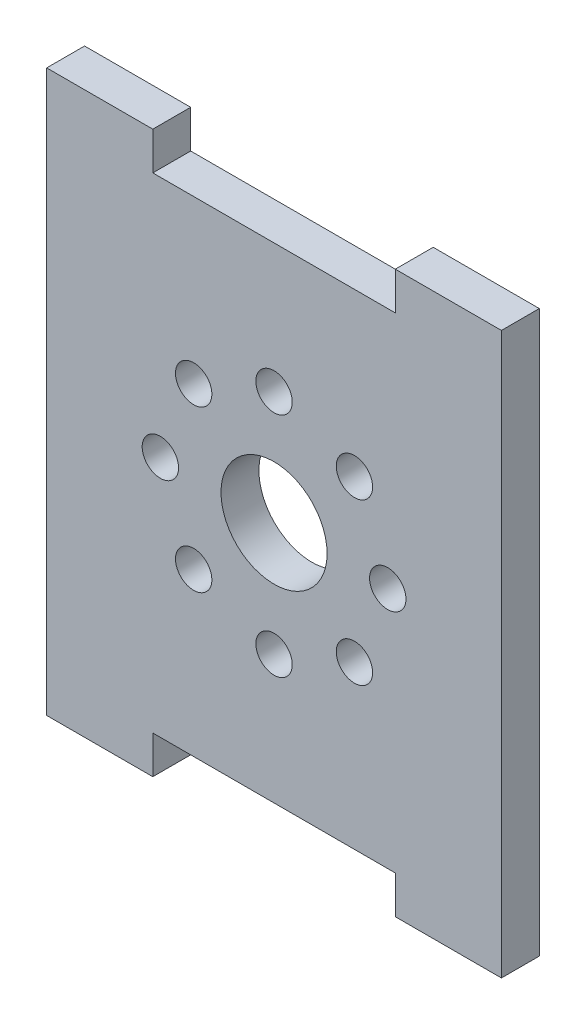
ISO-10303-21;
HEADER;
FILE_DESCRIPTION(('STEP AP214'),'2;1');
FILE_NAME('part.step','',(''),(''),'','','');
FILE_SCHEMA(('AUTOMOTIVE_DESIGN { 1 0 10303 214 1 1 1 1 }'));
ENDSEC;
DATA;
#1=APPLICATION_CONTEXT('core data for automotive mechanical design processes');
#2=APPLICATION_PROTOCOL_DEFINITION('international standard','automotive_design',2000,#1);
#3=PRODUCT_CONTEXT('',#1,'mechanical');
#4=PRODUCT('Part','Part','',(#3));
#5=PRODUCT_RELATED_PRODUCT_CATEGORY('part','',(#4));
#6=PRODUCT_DEFINITION_FORMATION('','',#4);
#7=PRODUCT_DEFINITION_CONTEXT('part definition',#1,'design');
#8=PRODUCT_DEFINITION('design','',#6,#7);
#9=PRODUCT_DEFINITION_SHAPE('','',#8);
#10=(LENGTH_UNIT() NAMED_UNIT(*) SI_UNIT(.MILLI.,.METRE.));
#11=(NAMED_UNIT(*) PLANE_ANGLE_UNIT() SI_UNIT($,.RADIAN.));
#12=(NAMED_UNIT(*) SI_UNIT($,.STERADIAN.) SOLID_ANGLE_UNIT());
#13=UNCERTAINTY_MEASURE_WITH_UNIT(LENGTH_MEASURE(1.E-05),#10,'distance_accuracy_value','');
#14=(GEOMETRIC_REPRESENTATION_CONTEXT(3) GLOBAL_UNCERTAINTY_ASSIGNED_CONTEXT((#13)) GLOBAL_UNIT_ASSIGNED_CONTEXT((#10,
#11,#12)) REPRESENTATION_CONTEXT('',''));
#15=CARTESIAN_POINT('',(0.,0.,0.));
#16=DIRECTION('',(0.,0.,1.));
#17=DIRECTION('',(1.,0.,0.));
#18=AXIS2_PLACEMENT_3D('',#15,#16,#17);
#19=CARTESIAN_POINT('',(0.,-16.,2.5));
#20=DIRECTION('',(0.,1.,0.));
#21=DIRECTION('',(0.,0.,1.));
#22=AXIS2_PLACEMENT_3D('',#19,#20,#21);
#23=PLANE('',#22);
#24=DIRECTION('',(1.,0.,0.));
#25=VECTOR('',#24,1.);
#26=CARTESIAN_POINT('',(0.,-16.,0.));
#27=LINE('',#26,#25);
#28=CARTESIAN_POINT('',(-8.,-16.,0.));
#29=VERTEX_POINT('',#28);
#30=CARTESIAN_POINT('',(8.,-16.,0.));
#31=VERTEX_POINT('',#30);
#32=EDGE_CURVE('E247',#29,#31,#27,.T.);
#33=ORIENTED_EDGE('',*,*,#32,.T.);
#34=DIRECTION('',(0.,0.,-1.));
#35=VECTOR('',#34,1.);
#36=CARTESIAN_POINT('',(8.,-16.,2.5));
#37=LINE('',#36,#35);
#38=CARTESIAN_POINT('',(8.,-16.,2.5));
#39=VERTEX_POINT('',#38);
#40=EDGE_CURVE('E11',#39,#31,#37,.T.);
#41=ORIENTED_EDGE('',*,*,#40,.F.);
#42=DIRECTION('',(1.,0.,0.));
#43=VECTOR('',#42,1.);
#44=CARTESIAN_POINT('',(0.,-16.,2.5));
#45=LINE('',#44,#43);
#46=CARTESIAN_POINT('',(-8.,-16.,2.5));
#47=VERTEX_POINT('',#46);
#48=EDGE_CURVE('E162',#47,#39,#45,.T.);
#49=ORIENTED_EDGE('',*,*,#48,.F.);
#50=DIRECTION('',(0.,0.,-1.));
#51=VECTOR('',#50,1.);
#52=CARTESIAN_POINT('',(-8.,-16.,2.5));
#53=LINE('',#52,#51);
#54=EDGE_CURVE('E52',#47,#29,#53,.T.);
#55=ORIENTED_EDGE('',*,*,#54,.T.);
#56=EDGE_LOOP('',(#33,#41,#49,#55));
#57=FACE_BOUND('',#56,.T.);
#58=ADVANCED_FACE('F35',(#57),#23,.F.);
#59=CARTESIAN_POINT('',(8.,0.,2.5));
#60=DIRECTION('',(1.,0.,0.));
#61=DIRECTION('',(0.,0.,-1.));
#62=AXIS2_PLACEMENT_3D('',#59,#60,#61);
#63=PLANE('',#62);
#64=DIRECTION('',(0.,-1.,0.));
#65=VECTOR('',#64,1.);
#66=CARTESIAN_POINT('',(8.,0.,0.));
#67=LINE('',#66,#65);
#68=CARTESIAN_POINT('',(8.,-18.5,0.));
#69=VERTEX_POINT('',#68);
#70=EDGE_CURVE('E249',#31,#69,#67,.T.);
#71=ORIENTED_EDGE('',*,*,#70,.T.);
#72=DIRECTION('',(0.,0.,-1.));
#73=VECTOR('',#72,1.);
#74=CARTESIAN_POINT('',(8.,-18.5,2.5));
#75=LINE('',#74,#73);
#76=CARTESIAN_POINT('',(8.,-18.5,2.5));
#77=VERTEX_POINT('',#76);
#78=EDGE_CURVE('E44',#77,#69,#75,.T.);
#79=ORIENTED_EDGE('',*,*,#78,.F.);
#80=DIRECTION('',(0.,-1.,0.));
#81=VECTOR('',#80,1.);
#82=CARTESIAN_POINT('',(8.,0.,2.5));
#83=LINE('',#82,#81);
#84=EDGE_CURVE('E102',#39,#77,#83,.T.);
#85=ORIENTED_EDGE('',*,*,#84,.F.);
#86=ORIENTED_EDGE('',*,*,#40,.T.);
#87=EDGE_LOOP('',(#71,#79,#85,#86));
#88=FACE_BOUND('',#87,.T.);
#89=ADVANCED_FACE('F293',(#88),#63,.F.);
#90=CARTESIAN_POINT('',(0.,-18.5,2.5));
#91=DIRECTION('',(0.,-1.,0.));
#92=DIRECTION('',(0.,0.,-1.));
#93=AXIS2_PLACEMENT_3D('',#90,#91,#92);
#94=PLANE('',#93);
#95=DIRECTION('',(-1.,0.,0.));
#96=VECTOR('',#95,1.);
#97=CARTESIAN_POINT('',(0.,-18.5,0.));
#98=LINE('',#97,#96);
#99=CARTESIAN_POINT('',(15.,-18.5,0.));
#100=VERTEX_POINT('',#99);
#101=EDGE_CURVE('E254',#100,#69,#98,.T.);
#102=ORIENTED_EDGE('',*,*,#101,.F.);
#103=DIRECTION('',(0.,0.,-1.));
#104=VECTOR('',#103,1.);
#105=CARTESIAN_POINT('',(15.,-18.5,2.5));
#106=LINE('',#105,#104);
#107=CARTESIAN_POINT('',(15.,-18.5,2.5));
#108=VERTEX_POINT('',#107);
#109=EDGE_CURVE('E290',#108,#100,#106,.T.);
#110=ORIENTED_EDGE('',*,*,#109,.F.);
#111=DIRECTION('',(-1.,0.,0.));
#112=VECTOR('',#111,1.);
#113=CARTESIAN_POINT('',(0.,-18.5,2.5));
#114=LINE('',#113,#112);
#115=EDGE_CURVE('E153',#108,#77,#114,.T.);
#116=ORIENTED_EDGE('',*,*,#115,.T.);
#117=ORIENTED_EDGE('',*,*,#78,.T.);
#118=EDGE_LOOP('',(#102,#110,#116,#117));
#119=FACE_BOUND('',#118,.T.);
#120=ADVANCED_FACE('F292',(#119),#94,.T.);
#121=CARTESIAN_POINT('',(15.,0.,2.5));
#122=DIRECTION('',(-1.,0.,0.));
#123=DIRECTION('',(0.,0.,1.));
#124=AXIS2_PLACEMENT_3D('',#121,#122,#123);
#125=PLANE('',#124);
#126=DIRECTION('',(0.,1.,0.));
#127=VECTOR('',#126,1.);
#128=CARTESIAN_POINT('',(15.,0.,0.));
#129=LINE('',#128,#127);
#130=CARTESIAN_POINT('',(15.,18.5,0.));
#131=VERTEX_POINT('',#130);
#132=EDGE_CURVE('E257',#100,#131,#129,.T.);
#133=ORIENTED_EDGE('',*,*,#132,.T.);
#134=DIRECTION('',(0.,0.,-1.));
#135=VECTOR('',#134,1.);
#136=CARTESIAN_POINT('',(15.,18.5,2.5));
#137=LINE('',#136,#135);
#138=CARTESIAN_POINT('',(15.,18.5,2.5));
#139=VERTEX_POINT('',#138);
#140=EDGE_CURVE('E287',#139,#131,#137,.T.);
#141=ORIENTED_EDGE('',*,*,#140,.F.);
#142=DIRECTION('',(0.,1.,0.));
#143=VECTOR('',#142,1.);
#144=CARTESIAN_POINT('',(15.,0.,2.5));
#145=LINE('',#144,#143);
#146=EDGE_CURVE('E158',#108,#139,#145,.T.);
#147=ORIENTED_EDGE('',*,*,#146,.F.);
#148=ORIENTED_EDGE('',*,*,#109,.T.);
#149=EDGE_LOOP('',(#133,#141,#147,#148));
#150=FACE_BOUND('',#149,.T.);
#151=ADVANCED_FACE('F300',(#150),#125,.F.);
#152=CARTESIAN_POINT('',(0.,18.5,2.5));
#153=DIRECTION('',(0.,-1.,0.));
#154=DIRECTION('',(0.,0.,-1.));
#155=AXIS2_PLACEMENT_3D('',#152,#153,#154);
#156=PLANE('',#155);
#157=DIRECTION('',(-1.,0.,0.));
#158=VECTOR('',#157,1.);
#159=CARTESIAN_POINT('',(0.,18.5,0.));
#160=LINE('',#159,#158);
#161=CARTESIAN_POINT('',(8.,18.5,0.));
#162=VERTEX_POINT('',#161);
#163=EDGE_CURVE('E260',#131,#162,#160,.T.);
#164=ORIENTED_EDGE('',*,*,#163,.T.);
#165=DIRECTION('',(0.,0.,-1.));
#166=VECTOR('',#165,1.);
#167=CARTESIAN_POINT('',(8.,18.5,2.5));
#168=LINE('',#167,#166);
#169=CARTESIAN_POINT('',(8.,18.5,2.5));
#170=VERTEX_POINT('',#169);
#171=EDGE_CURVE('E285',#170,#162,#168,.T.);
#172=ORIENTED_EDGE('',*,*,#171,.F.);
#173=DIRECTION('',(-1.,0.,0.));
#174=VECTOR('',#173,1.);
#175=CARTESIAN_POINT('',(0.,18.5,2.5));
#176=LINE('',#175,#174);
#177=EDGE_CURVE('E161',#139,#170,#176,.T.);
#178=ORIENTED_EDGE('',*,*,#177,.F.);
#179=ORIENTED_EDGE('',*,*,#140,.T.);
#180=EDGE_LOOP('',(#164,#172,#178,#179));
#181=FACE_BOUND('',#180,.T.);
#182=ADVANCED_FACE('F304',(#181),#156,.F.);
#183=CARTESIAN_POINT('',(8.,0.,2.5));
#184=DIRECTION('',(-1.,0.,0.));
#185=DIRECTION('',(0.,0.,1.));
#186=AXIS2_PLACEMENT_3D('',#183,#184,#185);
#187=PLANE('',#186);
#188=DIRECTION('',(0.,1.,0.));
#189=VECTOR('',#188,1.);
#190=CARTESIAN_POINT('',(8.,0.,0.));
#191=LINE('',#190,#189);
#192=CARTESIAN_POINT('',(8.,16.,0.));
#193=VERTEX_POINT('',#192);
#194=EDGE_CURVE('E263',#193,#162,#191,.T.);
#195=ORIENTED_EDGE('',*,*,#194,.F.);
#196=DIRECTION('',(0.,0.,-1.));
#197=VECTOR('',#196,1.);
#198=CARTESIAN_POINT('',(8.,16.,2.5));
#199=LINE('',#198,#197);
#200=CARTESIAN_POINT('',(8.,16.,2.5));
#201=VERTEX_POINT('',#200);
#202=EDGE_CURVE('E283',#201,#193,#199,.T.);
#203=ORIENTED_EDGE('',*,*,#202,.F.);
#204=DIRECTION('',(0.,1.,0.));
#205=VECTOR('',#204,1.);
#206=CARTESIAN_POINT('',(8.,0.,2.5));
#207=LINE('',#206,#205);
#208=EDGE_CURVE('E308',#201,#170,#207,.T.);
#209=ORIENTED_EDGE('',*,*,#208,.T.);
#210=ORIENTED_EDGE('',*,*,#171,.T.);
#211=EDGE_LOOP('',(#195,#203,#209,#210));
#212=FACE_BOUND('',#211,.T.);
#213=ADVANCED_FACE('F344',(#212),#187,.T.);
#214=CARTESIAN_POINT('',(0.,16.,2.5));
#215=DIRECTION('',(0.,-1.,0.));
#216=DIRECTION('',(0.,0.,-1.));
#217=AXIS2_PLACEMENT_3D('',#214,#215,#216);
#218=PLANE('',#217);
#219=DIRECTION('',(-1.,0.,0.));
#220=VECTOR('',#219,1.);
#221=CARTESIAN_POINT('',(0.,16.,0.));
#222=LINE('',#221,#220);
#223=CARTESIAN_POINT('',(-8.,16.,0.));
#224=VERTEX_POINT('',#223);
#225=EDGE_CURVE('E267',#193,#224,#222,.T.);
#226=ORIENTED_EDGE('',*,*,#225,.T.);
#227=DIRECTION('',(0.,0.,-1.));
#228=VECTOR('',#227,1.);
#229=CARTESIAN_POINT('',(-8.,16.,2.5));
#230=LINE('',#229,#228);
#231=CARTESIAN_POINT('',(-8.,16.,2.5));
#232=VERTEX_POINT('',#231);
#233=EDGE_CURVE('E280',#232,#224,#230,.T.);
#234=ORIENTED_EDGE('',*,*,#233,.F.);
#235=DIRECTION('',(-1.,0.,0.));
#236=VECTOR('',#235,1.);
#237=CARTESIAN_POINT('',(0.,16.,2.5));
#238=LINE('',#237,#236);
#239=EDGE_CURVE('E310',#201,#232,#238,.T.);
#240=ORIENTED_EDGE('',*,*,#239,.F.);
#241=ORIENTED_EDGE('',*,*,#202,.T.);
#242=EDGE_LOOP('',(#226,#234,#240,#241));
#243=FACE_BOUND('',#242,.T.);
#244=ADVANCED_FACE('F320',(#243),#218,.F.);
#245=CARTESIAN_POINT('',(-8.,0.,2.5));
#246=DIRECTION('',(-1.,0.,0.));
#247=DIRECTION('',(0.,0.,1.));
#248=AXIS2_PLACEMENT_3D('',#245,#246,#247);
#249=PLANE('',#248);
#250=DIRECTION('',(0.,1.,0.));
#251=VECTOR('',#250,1.);
#252=CARTESIAN_POINT('',(-8.,0.,0.));
#253=LINE('',#252,#251);
#254=CARTESIAN_POINT('',(-8.,18.5,0.));
#255=VERTEX_POINT('',#254);
#256=EDGE_CURVE('E269',#224,#255,#253,.T.);
#257=ORIENTED_EDGE('',*,*,#256,.T.);
#258=DIRECTION('',(0.,0.,-1.));
#259=VECTOR('',#258,1.);
#260=CARTESIAN_POINT('',(-8.,18.5,2.5));
#261=LINE('',#260,#259);
#262=CARTESIAN_POINT('',(-8.,18.5,2.5));
#263=VERTEX_POINT('',#262);
#264=EDGE_CURVE('E277',#263,#255,#261,.T.);
#265=ORIENTED_EDGE('',*,*,#264,.F.);
#266=DIRECTION('',(0.,1.,0.));
#267=VECTOR('',#266,1.);
#268=CARTESIAN_POINT('',(-8.,0.,2.5));
#269=LINE('',#268,#267);
#270=EDGE_CURVE('E312',#232,#263,#269,.T.);
#271=ORIENTED_EDGE('',*,*,#270,.F.);
#272=ORIENTED_EDGE('',*,*,#233,.T.);
#273=EDGE_LOOP('',(#257,#265,#271,#272));
#274=FACE_BOUND('',#273,.T.);
#275=ADVANCED_FACE('F324',(#274),#249,.F.);
#276=CARTESIAN_POINT('',(-15.,18.5,0.));
#277=VERTEX_POINT('',#276);
#278=EDGE_CURVE('E264',#255,#277,#160,.T.);
#279=ORIENTED_EDGE('',*,*,#278,.T.);
#280=DIRECTION('',(0.,0.,-1.));
#281=VECTOR('',#280,1.);
#282=CARTESIAN_POINT('',(-15.,18.5,2.5));
#283=LINE('',#282,#281);
#284=CARTESIAN_POINT('',(-15.,18.5,2.5));
#285=VERTEX_POINT('',#284);
#286=EDGE_CURVE('E139',#285,#277,#283,.T.);
#287=ORIENTED_EDGE('',*,*,#286,.F.);
#288=EDGE_CURVE('E147',#263,#285,#176,.T.);
#289=ORIENTED_EDGE('',*,*,#288,.F.);
#290=ORIENTED_EDGE('',*,*,#264,.T.);
#291=EDGE_LOOP('',(#279,#287,#289,#290));
#292=FACE_BOUND('',#291,.T.);
#293=ADVANCED_FACE('F328',(#292),#156,.F.);
#294=CARTESIAN_POINT('',(-15.,0.,2.5));
#295=DIRECTION('',(-1.,0.,0.));
#296=DIRECTION('',(0.,0.,1.));
#297=AXIS2_PLACEMENT_3D('',#294,#295,#296);
#298=PLANE('',#297);
#299=DIRECTION('',(0.,1.,0.));
#300=VECTOR('',#299,1.);
#301=CARTESIAN_POINT('',(-15.,0.,0.));
#302=LINE('',#301,#300);
#303=CARTESIAN_POINT('',(-15.,-18.5,0.));
#304=VERTEX_POINT('',#303);
#305=EDGE_CURVE('E135',#304,#277,#302,.T.);
#306=ORIENTED_EDGE('',*,*,#305,.F.);
#307=DIRECTION('',(0.,0.,-1.));
#308=VECTOR('',#307,1.);
#309=CARTESIAN_POINT('',(-15.,-18.5,2.5));
#310=LINE('',#309,#308);
#311=CARTESIAN_POINT('',(-15.,-18.5,2.5));
#312=VERTEX_POINT('',#311);
#313=EDGE_CURVE('E130',#312,#304,#310,.T.);
#314=ORIENTED_EDGE('',*,*,#313,.F.);
#315=DIRECTION('',(0.,1.,0.));
#316=VECTOR('',#315,1.);
#317=CARTESIAN_POINT('',(-15.,0.,2.5));
#318=LINE('',#317,#316);
#319=EDGE_CURVE('E133',#312,#285,#318,.T.);
#320=ORIENTED_EDGE('',*,*,#319,.T.);
#321=ORIENTED_EDGE('',*,*,#286,.T.);
#322=EDGE_LOOP('',(#306,#314,#320,#321));
#323=FACE_BOUND('',#322,.T.);
#324=ADVANCED_FACE('F132',(#323),#298,.T.);
#325=CARTESIAN_POINT('',(-8.,-18.5,0.));
#326=VERTEX_POINT('',#325);
#327=EDGE_CURVE('E258',#326,#304,#98,.T.);
#328=ORIENTED_EDGE('',*,*,#327,.F.);
#329=DIRECTION('',(0.,0.,-1.));
#330=VECTOR('',#329,1.);
#331=CARTESIAN_POINT('',(-8.,-18.5,2.5));
#332=LINE('',#331,#330);
#333=CARTESIAN_POINT('',(-8.,-18.5,2.5));
#334=VERTEX_POINT('',#333);
#335=EDGE_CURVE('E90',#334,#326,#332,.T.);
#336=ORIENTED_EDGE('',*,*,#335,.F.);
#337=EDGE_CURVE('E145',#334,#312,#114,.T.);
#338=ORIENTED_EDGE('',*,*,#337,.T.);
#339=ORIENTED_EDGE('',*,*,#313,.T.);
#340=EDGE_LOOP('',(#328,#336,#338,#339));
#341=FACE_BOUND('',#340,.T.);
#342=ADVANCED_FACE('F150',(#341),#94,.T.);
#343=CARTESIAN_POINT('',(0.,0.,2.5));
#344=DIRECTION('',(0.,0.,-1.));
#345=DIRECTION('',(-1.,0.,0.));
#346=AXIS2_PLACEMENT_3D('',#343,#344,#345);
#347=CYLINDRICAL_SURFACE('',#346,3.5);
#348=CARTESIAN_POINT('',(0.,0.,2.5));
#349=DIRECTION('',(0.,0.,1.));
#350=DIRECTION('',(1.,0.,0.));
#351=AXIS2_PLACEMENT_3D('',#348,#349,#350);
#352=CIRCLE('',#351,3.5);
#353=CARTESIAN_POINT('',(3.49999999999999,0.,2.5));
#354=VERTEX_POINT('',#353);
#355=EDGE_CURVE('E163',#354,#354,#352,.T.);
#356=ORIENTED_EDGE('',*,*,#355,.T.);
#357=EDGE_LOOP('',(#356));
#358=FACE_BOUND('',#357,.T.);
#359=CARTESIAN_POINT('',(0.,0.,0.));
#360=DIRECTION('',(0.,0.,1.));
#361=DIRECTION('',(1.,0.,0.));
#362=AXIS2_PLACEMENT_3D('',#359,#360,#361);
#363=CIRCLE('',#362,3.5);
#364=CARTESIAN_POINT('',(3.49999999999999,0.,0.));
#365=VERTEX_POINT('',#364);
#366=EDGE_CURVE('E172',#365,#365,#363,.T.);
#367=ORIENTED_EDGE('',*,*,#366,.F.);
#368=EDGE_LOOP('',(#367));
#369=FACE_BOUND('',#368,.T.);
#370=ADVANCED_FACE('F37',(#358,#369),#347,.F.);
#371=CARTESIAN_POINT('',(-8.,0.,2.5));
#372=DIRECTION('',(1.,0.,0.));
#373=DIRECTION('',(0.,0.,-1.));
#374=AXIS2_PLACEMENT_3D('',#371,#372,#373);
#375=PLANE('',#374);
#376=DIRECTION('',(0.,-1.,0.));
#377=VECTOR('',#376,1.);
#378=CARTESIAN_POINT('',(-8.,0.,0.));
#379=LINE('',#378,#377);
#380=EDGE_CURVE('E168',#29,#326,#379,.T.);
#381=ORIENTED_EDGE('',*,*,#380,.F.);
#382=ORIENTED_EDGE('',*,*,#54,.F.);
#383=DIRECTION('',(0.,-1.,0.));
#384=VECTOR('',#383,1.);
#385=CARTESIAN_POINT('',(-8.,0.,2.5));
#386=LINE('',#385,#384);
#387=EDGE_CURVE('E151',#47,#334,#386,.T.);
#388=ORIENTED_EDGE('',*,*,#387,.T.);
#389=ORIENTED_EDGE('',*,*,#335,.T.);
#390=EDGE_LOOP('',(#381,#382,#388,#389));
#391=FACE_BOUND('',#390,.T.);
#392=ADVANCED_FACE('F224',(#391),#375,.T.);
#393=CARTESIAN_POINT('',(0.,0.,2.5));
#394=DIRECTION('',(0.,0.,1.));
#395=DIRECTION('',(1.,0.,0.));
#396=AXIS2_PLACEMENT_3D('',#393,#394,#395);
#397=PLANE('',#396);
#398=CARTESIAN_POINT('',(-5.30330085889904,5.30330085889917,2.5));
#399=DIRECTION('',(0.,0.,1.));
#400=DIRECTION('',(1.,0.,0.));
#401=AXIS2_PLACEMENT_3D('',#398,#399,#400);
#402=CIRCLE('',#401,1.2);
#403=CARTESIAN_POINT('',(-4.10330085889904,5.30330085889917,2.5));
#404=VERTEX_POINT('',#403);
#405=EDGE_CURVE('E215',#404,#404,#402,.T.);
#406=ORIENTED_EDGE('',*,*,#405,.F.);
#407=EDGE_LOOP('',(#406));
#408=FACE_BOUND('',#407,.T.);
#409=CARTESIAN_POINT('',(-7.5,0.,2.5));
#410=DIRECTION('',(0.,0.,1.));
#411=DIRECTION('',(1.,0.,0.));
#412=AXIS2_PLACEMENT_3D('',#409,#410,#411);
#413=CIRCLE('',#412,1.2);
#414=CARTESIAN_POINT('',(-6.3,0.,2.5));
#415=VERTEX_POINT('',#414);
#416=EDGE_CURVE('E209',#415,#415,#413,.T.);
#417=ORIENTED_EDGE('',*,*,#416,.F.);
#418=EDGE_LOOP('',(#417));
#419=FACE_BOUND('',#418,.T.);
#420=CARTESIAN_POINT('',(-5.30330085889915,-5.30330085889906,2.5));
#421=DIRECTION('',(0.,0.,1.));
#422=DIRECTION('',(1.,0.,0.));
#423=AXIS2_PLACEMENT_3D('',#420,#421,#422);
#424=CIRCLE('',#423,1.2);
#425=CARTESIAN_POINT('',(-4.10330085889915,-5.30330085889906,2.5));
#426=VERTEX_POINT('',#425);
#427=EDGE_CURVE('E203',#426,#426,#424,.T.);
#428=ORIENTED_EDGE('',*,*,#427,.F.);
#429=EDGE_LOOP('',(#428));
#430=FACE_BOUND('',#429,.T.);
#431=CARTESIAN_POINT('',(0.,-7.5,2.5));
#432=DIRECTION('',(0.,0.,1.));
#433=DIRECTION('',(1.,0.,0.));
#434=AXIS2_PLACEMENT_3D('',#431,#432,#433);
#435=CIRCLE('',#434,1.2);
#436=CARTESIAN_POINT('',(1.2,-7.5,2.5));
#437=VERTEX_POINT('',#436);
#438=EDGE_CURVE('E197',#437,#437,#435,.T.);
#439=ORIENTED_EDGE('',*,*,#438,.F.);
#440=EDGE_LOOP('',(#439));
#441=FACE_BOUND('',#440,.T.);
#442=CARTESIAN_POINT('',(5.30330085889908,-5.30330085889913,2.5));
#443=DIRECTION('',(0.,0.,1.));
#444=DIRECTION('',(1.,0.,0.));
#445=AXIS2_PLACEMENT_3D('',#442,#443,#444);
#446=CIRCLE('',#445,1.2);
#447=CARTESIAN_POINT('',(6.50330085889908,-5.30330085889913,2.5));
#448=VERTEX_POINT('',#447);
#449=EDGE_CURVE('E191',#448,#448,#446,.T.);
#450=ORIENTED_EDGE('',*,*,#449,.F.);
#451=EDGE_LOOP('',(#450));
#452=FACE_BOUND('',#451,.T.);
#453=CARTESIAN_POINT('',(7.5,0.,2.5));
#454=DIRECTION('',(0.,0.,1.));
#455=DIRECTION('',(1.,0.,0.));
#456=AXIS2_PLACEMENT_3D('',#453,#454,#455);
#457=CIRCLE('',#456,1.2);
#458=CARTESIAN_POINT('',(8.7,0.,2.5));
#459=VERTEX_POINT('',#458);
#460=EDGE_CURVE('E185',#459,#459,#457,.T.);
#461=ORIENTED_EDGE('',*,*,#460,.F.);
#462=EDGE_LOOP('',(#461));
#463=FACE_BOUND('',#462,.T.);
#464=CARTESIAN_POINT('',(5.30330085889912,5.3033008588991,2.5));
#465=DIRECTION('',(0.,0.,1.));
#466=DIRECTION('',(1.,0.,0.));
#467=AXIS2_PLACEMENT_3D('',#464,#465,#466);
#468=CIRCLE('',#467,1.2);
#469=CARTESIAN_POINT('',(6.50330085889911,5.3033008588991,2.5));
#470=VERTEX_POINT('',#469);
#471=EDGE_CURVE('E179',#470,#470,#468,.T.);
#472=ORIENTED_EDGE('',*,*,#471,.F.);
#473=EDGE_LOOP('',(#472));
#474=FACE_BOUND('',#473,.T.);
#475=CARTESIAN_POINT('',(0.,7.5,2.5));
#476=DIRECTION('',(0.,0.,1.));
#477=DIRECTION('',(1.,0.,0.));
#478=AXIS2_PLACEMENT_3D('',#475,#476,#477);
#479=CIRCLE('',#478,1.2);
#480=CARTESIAN_POINT('',(1.2,7.5,2.5));
#481=VERTEX_POINT('',#480);
#482=EDGE_CURVE('E173',#481,#481,#479,.T.);
#483=ORIENTED_EDGE('',*,*,#482,.F.);
#484=EDGE_LOOP('',(#483));
#485=FACE_BOUND('',#484,.T.);
#486=ORIENTED_EDGE('',*,*,#355,.F.);
#487=EDGE_LOOP('',(#486));
#488=FACE_BOUND('',#487,.T.);
#489=ORIENTED_EDGE('',*,*,#48,.T.);
#490=ORIENTED_EDGE('',*,*,#84,.T.);
#491=ORIENTED_EDGE('',*,*,#115,.F.);
#492=ORIENTED_EDGE('',*,*,#146,.T.);
#493=ORIENTED_EDGE('',*,*,#177,.T.);
#494=ORIENTED_EDGE('',*,*,#208,.F.);
#495=ORIENTED_EDGE('',*,*,#239,.T.);
#496=ORIENTED_EDGE('',*,*,#270,.T.);
#497=ORIENTED_EDGE('',*,*,#288,.T.);
#498=ORIENTED_EDGE('',*,*,#319,.F.);
#499=ORIENTED_EDGE('',*,*,#337,.F.);
#500=ORIENTED_EDGE('',*,*,#387,.F.);
#501=EDGE_LOOP('',(#489,#490,#491,#492,#493,#494,#495,#496,#497,#498,#499,#500));
#502=FACE_BOUND('',#501,.T.);
#503=ADVANCED_FACE('F143',(#408,#419,#430,#441,#452,#463,#474,#485,#488,#502),#397,.T.);
#504=CARTESIAN_POINT('',(0.,0.,0.));
#505=DIRECTION('',(0.,0.,1.));
#506=DIRECTION('',(1.,0.,0.));
#507=AXIS2_PLACEMENT_3D('',#504,#505,#506);
#508=PLANE('',#507);
#509=CARTESIAN_POINT('',(-5.30330085889904,5.30330085889917,0.));
#510=DIRECTION('',(0.,0.,1.));
#511=DIRECTION('',(1.,0.,0.));
#512=AXIS2_PLACEMENT_3D('',#509,#510,#511);
#513=CIRCLE('',#512,1.2);
#514=CARTESIAN_POINT('',(-4.10330085889904,5.30330085889917,0.));
#515=VERTEX_POINT('',#514);
#516=EDGE_CURVE('E212',#515,#515,#513,.T.);
#517=ORIENTED_EDGE('',*,*,#516,.T.);
#518=EDGE_LOOP('',(#517));
#519=FACE_BOUND('',#518,.T.);
#520=CARTESIAN_POINT('',(-7.5,0.,0.));
#521=DIRECTION('',(0.,0.,1.));
#522=DIRECTION('',(1.,0.,0.));
#523=AXIS2_PLACEMENT_3D('',#520,#521,#522);
#524=CIRCLE('',#523,1.2);
#525=CARTESIAN_POINT('',(-6.3,0.,0.));
#526=VERTEX_POINT('',#525);
#527=EDGE_CURVE('E206',#526,#526,#524,.T.);
#528=ORIENTED_EDGE('',*,*,#527,.T.);
#529=EDGE_LOOP('',(#528));
#530=FACE_BOUND('',#529,.T.);
#531=CARTESIAN_POINT('',(-5.30330085889915,-5.30330085889906,0.));
#532=DIRECTION('',(0.,0.,1.));
#533=DIRECTION('',(1.,0.,0.));
#534=AXIS2_PLACEMENT_3D('',#531,#532,#533);
#535=CIRCLE('',#534,1.2);
#536=CARTESIAN_POINT('',(-4.10330085889915,-5.30330085889906,0.));
#537=VERTEX_POINT('',#536);
#538=EDGE_CURVE('E200',#537,#537,#535,.T.);
#539=ORIENTED_EDGE('',*,*,#538,.T.);
#540=EDGE_LOOP('',(#539));
#541=FACE_BOUND('',#540,.T.);
#542=CARTESIAN_POINT('',(0.,-7.5,0.));
#543=DIRECTION('',(0.,0.,1.));
#544=DIRECTION('',(1.,0.,0.));
#545=AXIS2_PLACEMENT_3D('',#542,#543,#544);
#546=CIRCLE('',#545,1.2);
#547=CARTESIAN_POINT('',(1.2,-7.5,0.));
#548=VERTEX_POINT('',#547);
#549=EDGE_CURVE('E194',#548,#548,#546,.T.);
#550=ORIENTED_EDGE('',*,*,#549,.T.);
#551=EDGE_LOOP('',(#550));
#552=FACE_BOUND('',#551,.T.);
#553=CARTESIAN_POINT('',(5.30330085889908,-5.30330085889913,0.));
#554=DIRECTION('',(0.,0.,1.));
#555=DIRECTION('',(1.,0.,0.));
#556=AXIS2_PLACEMENT_3D('',#553,#554,#555);
#557=CIRCLE('',#556,1.2);
#558=CARTESIAN_POINT('',(6.50330085889908,-5.30330085889913,0.));
#559=VERTEX_POINT('',#558);
#560=EDGE_CURVE('E188',#559,#559,#557,.T.);
#561=ORIENTED_EDGE('',*,*,#560,.T.);
#562=EDGE_LOOP('',(#561));
#563=FACE_BOUND('',#562,.T.);
#564=CARTESIAN_POINT('',(7.5,0.,0.));
#565=DIRECTION('',(0.,0.,1.));
#566=DIRECTION('',(1.,0.,0.));
#567=AXIS2_PLACEMENT_3D('',#564,#565,#566);
#568=CIRCLE('',#567,1.2);
#569=CARTESIAN_POINT('',(8.7,0.,0.));
#570=VERTEX_POINT('',#569);
#571=EDGE_CURVE('E182',#570,#570,#568,.T.);
#572=ORIENTED_EDGE('',*,*,#571,.T.);
#573=EDGE_LOOP('',(#572));
#574=FACE_BOUND('',#573,.T.);
#575=CARTESIAN_POINT('',(5.30330085889912,5.3033008588991,0.));
#576=DIRECTION('',(0.,0.,1.));
#577=DIRECTION('',(1.,0.,0.));
#578=AXIS2_PLACEMENT_3D('',#575,#576,#577);
#579=CIRCLE('',#578,1.2);
#580=CARTESIAN_POINT('',(6.50330085889911,5.3033008588991,0.));
#581=VERTEX_POINT('',#580);
#582=EDGE_CURVE('E176',#581,#581,#579,.T.);
#583=ORIENTED_EDGE('',*,*,#582,.T.);
#584=EDGE_LOOP('',(#583));
#585=FACE_BOUND('',#584,.T.);
#586=CARTESIAN_POINT('',(0.,7.5,0.));
#587=DIRECTION('',(0.,0.,1.));
#588=DIRECTION('',(1.,0.,0.));
#589=AXIS2_PLACEMENT_3D('',#586,#587,#588);
#590=CIRCLE('',#589,1.2);
#591=CARTESIAN_POINT('',(1.2,7.5,0.));
#592=VERTEX_POINT('',#591);
#593=EDGE_CURVE('E169',#592,#592,#590,.T.);
#594=ORIENTED_EDGE('',*,*,#593,.T.);
#595=EDGE_LOOP('',(#594));
#596=FACE_BOUND('',#595,.T.);
#597=ORIENTED_EDGE('',*,*,#366,.T.);
#598=EDGE_LOOP('',(#597));
#599=FACE_BOUND('',#598,.T.);
#600=ORIENTED_EDGE('',*,*,#32,.F.);
#601=ORIENTED_EDGE('',*,*,#380,.T.);
#602=ORIENTED_EDGE('',*,*,#327,.T.);
#603=ORIENTED_EDGE('',*,*,#305,.T.);
#604=ORIENTED_EDGE('',*,*,#278,.F.);
#605=ORIENTED_EDGE('',*,*,#256,.F.);
#606=ORIENTED_EDGE('',*,*,#225,.F.);
#607=ORIENTED_EDGE('',*,*,#194,.T.);
#608=ORIENTED_EDGE('',*,*,#163,.F.);
#609=ORIENTED_EDGE('',*,*,#132,.F.);
#610=ORIENTED_EDGE('',*,*,#101,.T.);
#611=ORIENTED_EDGE('',*,*,#70,.F.);
#612=EDGE_LOOP('',(#600,#601,#602,#603,#604,#605,#606,#607,#608,#609,#610,#611));
#613=FACE_BOUND('',#612,.T.);
#614=ADVANCED_FACE('F223',(#519,#530,#541,#552,#563,#574,#585,#596,#599,#613),#508,.F.);
#615=CARTESIAN_POINT('',(0.,7.5,2.5));
#616=DIRECTION('',(0.,0.,1.));
#617=DIRECTION('',(1.,0.,0.));
#618=AXIS2_PLACEMENT_3D('',#615,#616,#617);
#619=CYLINDRICAL_SURFACE('',#618,1.2);
#620=ORIENTED_EDGE('',*,*,#593,.F.);
#621=EDGE_LOOP('',(#620));
#622=FACE_BOUND('',#621,.T.);
#623=ORIENTED_EDGE('',*,*,#482,.T.);
#624=EDGE_LOOP('',(#623));
#625=FACE_BOUND('',#624,.T.);
#626=ADVANCED_FACE('F412',(#622,#625),#619,.F.);
#627=CARTESIAN_POINT('',(5.30330085889912,5.3033008588991,2.5));
#628=DIRECTION('',(0.,0.,1.));
#629=DIRECTION('',(1.,0.,0.));
#630=AXIS2_PLACEMENT_3D('',#627,#628,#629);
#631=CYLINDRICAL_SURFACE('',#630,1.2);
#632=ORIENTED_EDGE('',*,*,#582,.F.);
#633=EDGE_LOOP('',(#632));
#634=FACE_BOUND('',#633,.T.);
#635=ORIENTED_EDGE('',*,*,#471,.T.);
#636=EDGE_LOOP('',(#635));
#637=FACE_BOUND('',#636,.T.);
#638=ADVANCED_FACE('F416',(#634,#637),#631,.F.);
#639=CARTESIAN_POINT('',(7.5,0.,2.5));
#640=DIRECTION('',(0.,0.,1.));
#641=DIRECTION('',(1.,0.,0.));
#642=AXIS2_PLACEMENT_3D('',#639,#640,#641);
#643=CYLINDRICAL_SURFACE('',#642,1.2);
#644=ORIENTED_EDGE('',*,*,#571,.F.);
#645=EDGE_LOOP('',(#644));
#646=FACE_BOUND('',#645,.T.);
#647=ORIENTED_EDGE('',*,*,#460,.T.);
#648=EDGE_LOOP('',(#647));
#649=FACE_BOUND('',#648,.T.);
#650=ADVANCED_FACE('F435',(#646,#649),#643,.F.);
#651=CARTESIAN_POINT('',(5.30330085889908,-5.30330085889913,2.5));
#652=DIRECTION('',(0.,0.,1.));
#653=DIRECTION('',(1.,0.,0.));
#654=AXIS2_PLACEMENT_3D('',#651,#652,#653);
#655=CYLINDRICAL_SURFACE('',#654,1.2);
#656=ORIENTED_EDGE('',*,*,#560,.F.);
#657=EDGE_LOOP('',(#656));
#658=FACE_BOUND('',#657,.T.);
#659=ORIENTED_EDGE('',*,*,#449,.T.);
#660=EDGE_LOOP('',(#659));
#661=FACE_BOUND('',#660,.T.);
#662=ADVANCED_FACE('F445',(#658,#661),#655,.F.);
#663=CARTESIAN_POINT('',(0.,-7.5,2.5));
#664=DIRECTION('',(0.,0.,1.));
#665=DIRECTION('',(1.,0.,0.));
#666=AXIS2_PLACEMENT_3D('',#663,#664,#665);
#667=CYLINDRICAL_SURFACE('',#666,1.2);
#668=ORIENTED_EDGE('',*,*,#549,.F.);
#669=EDGE_LOOP('',(#668));
#670=FACE_BOUND('',#669,.T.);
#671=ORIENTED_EDGE('',*,*,#438,.T.);
#672=EDGE_LOOP('',(#671));
#673=FACE_BOUND('',#672,.T.);
#674=ADVANCED_FACE('F455',(#670,#673),#667,.F.);
#675=CARTESIAN_POINT('',(-5.30330085889915,-5.30330085889906,2.5));
#676=DIRECTION('',(0.,0.,1.));
#677=DIRECTION('',(1.,0.,0.));
#678=AXIS2_PLACEMENT_3D('',#675,#676,#677);
#679=CYLINDRICAL_SURFACE('',#678,1.2);
#680=ORIENTED_EDGE('',*,*,#538,.F.);
#681=EDGE_LOOP('',(#680));
#682=FACE_BOUND('',#681,.T.);
#683=ORIENTED_EDGE('',*,*,#427,.T.);
#684=EDGE_LOOP('',(#683));
#685=FACE_BOUND('',#684,.T.);
#686=ADVANCED_FACE('F465',(#682,#685),#679,.F.);
#687=CARTESIAN_POINT('',(-7.5,0.,2.5));
#688=DIRECTION('',(0.,0.,1.));
#689=DIRECTION('',(1.,0.,0.));
#690=AXIS2_PLACEMENT_3D('',#687,#688,#689);
#691=CYLINDRICAL_SURFACE('',#690,1.2);
#692=ORIENTED_EDGE('',*,*,#527,.F.);
#693=EDGE_LOOP('',(#692));
#694=FACE_BOUND('',#693,.T.);
#695=ORIENTED_EDGE('',*,*,#416,.T.);
#696=EDGE_LOOP('',(#695));
#697=FACE_BOUND('',#696,.T.);
#698=ADVANCED_FACE('F475',(#694,#697),#691,.F.);
#699=CARTESIAN_POINT('',(-5.30330085889904,5.30330085889917,2.5));
#700=DIRECTION('',(0.,0.,1.));
#701=DIRECTION('',(1.,0.,0.));
#702=AXIS2_PLACEMENT_3D('',#699,#700,#701);
#703=CYLINDRICAL_SURFACE('',#702,1.2);
#704=ORIENTED_EDGE('',*,*,#516,.F.);
#705=EDGE_LOOP('',(#704));
#706=FACE_BOUND('',#705,.T.);
#707=ORIENTED_EDGE('',*,*,#405,.T.);
#708=EDGE_LOOP('',(#707));
#709=FACE_BOUND('',#708,.T.);
#710=ADVANCED_FACE('F219',(#706,#709),#703,.F.);
#711=CLOSED_SHELL('',(#58,#89,#120,#151,#182,#213,#244,#275,#293,#324,#342,#370,#392,#503,#614,
#626,#638,#650,#662,#674,#686,#698,#710));
#712=MANIFOLD_SOLID_BREP('B2',#711);
#713=ADVANCED_BREP_SHAPE_REPRESENTATION('',(#18,#712),#14);
#714=SHAPE_DEFINITION_REPRESENTATION(#9,#713);
ENDSEC;
END-ISO-10303-21;
